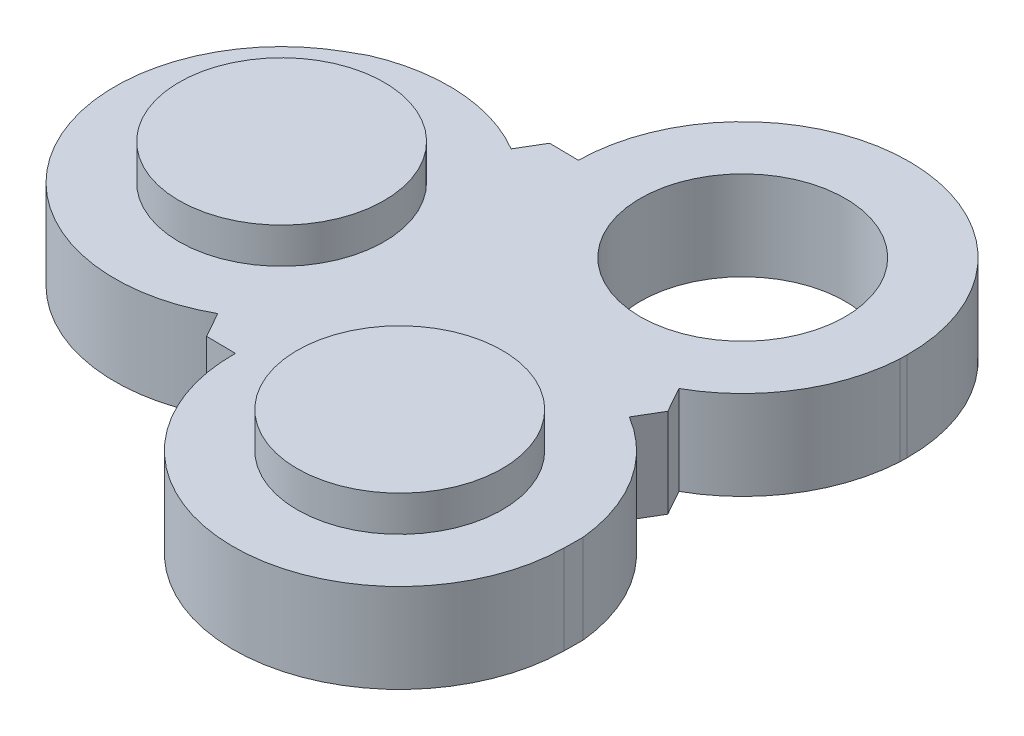
ISO-10303-21;
HEADER;
FILE_DESCRIPTION(('STEP AP214'),'2;1');
FILE_NAME('part.step','',(''),(''),'','','');
FILE_SCHEMA(('AUTOMOTIVE_DESIGN { 1 0 10303 214 1 1 1 1 }'));
ENDSEC;
DATA;
#1=APPLICATION_CONTEXT('core data for automotive mechanical design processes');
#2=APPLICATION_PROTOCOL_DEFINITION('international standard','automotive_design',2000,#1);
#3=PRODUCT_CONTEXT('',#1,'mechanical');
#4=PRODUCT('Part','Part','',(#3));
#5=PRODUCT_RELATED_PRODUCT_CATEGORY('part','',(#4));
#6=PRODUCT_DEFINITION_FORMATION('','',#4);
#7=PRODUCT_DEFINITION_CONTEXT('part definition',#1,'design');
#8=PRODUCT_DEFINITION('design','',#6,#7);
#9=PRODUCT_DEFINITION_SHAPE('','',#8);
#10=(LENGTH_UNIT() NAMED_UNIT(*) SI_UNIT(.MILLI.,.METRE.));
#11=(NAMED_UNIT(*) PLANE_ANGLE_UNIT() SI_UNIT($,.RADIAN.));
#12=(NAMED_UNIT(*) SI_UNIT($,.STERADIAN.) SOLID_ANGLE_UNIT());
#13=UNCERTAINTY_MEASURE_WITH_UNIT(LENGTH_MEASURE(1.E-05),#10,'distance_accuracy_value','');
#14=(GEOMETRIC_REPRESENTATION_CONTEXT(3) GLOBAL_UNCERTAINTY_ASSIGNED_CONTEXT((#13)) GLOBAL_UNIT_ASSIGNED_CONTEXT((#10,
#11,#12)) REPRESENTATION_CONTEXT('',''));
#15=CARTESIAN_POINT('',(0.,0.,0.));
#16=DIRECTION('',(0.,0.,1.));
#17=DIRECTION('',(1.,0.,0.));
#18=AXIS2_PLACEMENT_3D('',#15,#16,#17);
#19=CARTESIAN_POINT('',(-11.0081982102361,3.,-0.13868374074223));
#20=DIRECTION('',(0.,1.,0.));
#21=DIRECTION('',(0.,0.,1.));
#22=AXIS2_PLACEMENT_3D('',#19,#20,#21);
#23=CYLINDRICAL_SURFACE('',#22,5.75);
#24=CARTESIAN_POINT('',(-11.0081982102361,3.,-0.13868374074223));
#25=DIRECTION('',(0.,1.,0.));
#26=DIRECTION('',(0.,0.,1.));
#27=AXIS2_PLACEMENT_3D('',#24,#25,#26);
#28=CIRCLE('',#27,5.75);
#29=CARTESIAN_POINT('',(-11.0081982102361,3.,5.61131625925777));
#30=VERTEX_POINT('',#29);
#31=EDGE_CURVE('E12',#30,#30,#28,.T.);
#32=ORIENTED_EDGE('',*,*,#31,.T.);
#33=EDGE_LOOP('',(#32));
#34=FACE_BOUND('',#33,.T.);
#35=CARTESIAN_POINT('',(-11.0081982102361,7.,-0.13868374074223));
#36=DIRECTION('',(0.,1.,0.));
#37=DIRECTION('',(0.,0.,1.));
#38=AXIS2_PLACEMENT_3D('',#35,#36,#37);
#39=CIRCLE('',#38,5.75);
#40=CARTESIAN_POINT('',(-11.0081982102361,7.,5.61131625925777));
#41=VERTEX_POINT('',#40);
#42=EDGE_CURVE('E195',#41,#41,#39,.T.);
#43=ORIENTED_EDGE('',*,*,#42,.F.);
#44=EDGE_LOOP('',(#43));
#45=FACE_BOUND('',#44,.T.);
#46=ADVANCED_FACE('F189',(#34,#45),#23,.T.);
#47=CARTESIAN_POINT('',(-11.0081982102361,3.,-0.13868374074223));
#48=DIRECTION('',(0.,1.,0.));
#49=DIRECTION('',(0.,0.,1.));
#50=AXIS2_PLACEMENT_3D('',#47,#48,#49);
#51=PLANE('',#50);
#52=ORIENTED_EDGE('',*,*,#31,.F.);
#53=EDGE_LOOP('',(#52));
#54=FACE_BOUND('',#53,.T.);
#55=ADVANCED_FACE('F204',(#54),#51,.F.);
#56=CARTESIAN_POINT('',(-11.0081982102361,7.,-0.13868374074223));
#57=DIRECTION('',(0.,1.,0.));
#58=DIRECTION('',(0.,0.,1.));
#59=AXIS2_PLACEMENT_3D('',#56,#57,#58);
#60=PLANE('',#59);
#61=ORIENTED_EDGE('',*,*,#42,.T.);
#62=EDGE_LOOP('',(#61));
#63=FACE_BOUND('',#62,.T.);
#64=ADVANCED_FACE('F201',(#63),#60,.T.);
#65=CLOSED_SHELL('',(#46,#55,#64));
#66=MANIFOLD_SOLID_BREP('B2',#65);
#67=CARTESIAN_POINT('',(5.32530520249275,3.,9.56784325228541));
#68=DIRECTION('',(0.,1.,0.));
#69=DIRECTION('',(0.,0.,1.));
#70=AXIS2_PLACEMENT_3D('',#67,#68,#69);
#71=CYLINDRICAL_SURFACE('',#70,5.75000000000001);
#72=CARTESIAN_POINT('',(5.32530520249275,3.,9.56784325228541));
#73=DIRECTION('',(0.,1.,0.));
#74=DIRECTION('',(0.,0.,1.));
#75=AXIS2_PLACEMENT_3D('',#72,#73,#74);
#76=CIRCLE('',#75,5.75000000000001);
#77=CARTESIAN_POINT('',(5.32530520249275,3.,15.3178432522854));
#78=VERTEX_POINT('',#77);
#79=EDGE_CURVE('E188',#78,#78,#76,.T.);
#80=ORIENTED_EDGE('',*,*,#79,.T.);
#81=EDGE_LOOP('',(#80));
#82=FACE_BOUND('',#81,.T.);
#83=CARTESIAN_POINT('',(5.32530520249275,7.,9.56784325228541));
#84=DIRECTION('',(0.,1.,0.));
#85=DIRECTION('',(0.,0.,1.));
#86=AXIS2_PLACEMENT_3D('',#83,#84,#85);
#87=CIRCLE('',#86,5.75000000000001);
#88=CARTESIAN_POINT('',(5.32530520249275,7.,15.3178432522854));
#89=VERTEX_POINT('',#88);
#90=EDGE_CURVE('E244',#89,#89,#87,.T.);
#91=ORIENTED_EDGE('',*,*,#90,.F.);
#92=EDGE_LOOP('',(#91));
#93=FACE_BOUND('',#92,.T.);
#94=ADVANCED_FACE('F238',(#82,#93),#71,.T.);
#95=CARTESIAN_POINT('',(5.32530520249275,3.,9.56784325228541));
#96=DIRECTION('',(0.,1.,0.));
#97=DIRECTION('',(0.,0.,1.));
#98=AXIS2_PLACEMENT_3D('',#95,#96,#97);
#99=PLANE('',#98);
#100=ORIENTED_EDGE('',*,*,#79,.F.);
#101=EDGE_LOOP('',(#100));
#102=FACE_BOUND('',#101,.T.);
#103=ADVANCED_FACE('F253',(#102),#99,.F.);
#104=CARTESIAN_POINT('',(5.32530520249275,7.,9.56784325228541));
#105=DIRECTION('',(0.,1.,0.));
#106=DIRECTION('',(0.,0.,1.));
#107=AXIS2_PLACEMENT_3D('',#104,#105,#106);
#108=PLANE('',#107);
#109=ORIENTED_EDGE('',*,*,#90,.T.);
#110=EDGE_LOOP('',(#109));
#111=FACE_BOUND('',#110,.T.);
#112=ADVANCED_FACE('F250',(#111),#108,.T.);
#113=CLOSED_SHELL('',(#94,#103,#112));
#114=MANIFOLD_SOLID_BREP('B7',#113);
#115=CARTESIAN_POINT('',(0.,5.,0.));
#116=DIRECTION('',(0.,1.,0.));
#117=DIRECTION('',(0.,0.,1.));
#118=AXIS2_PLACEMENT_3D('',#115,#116,#117);
#119=PLANE('',#118);
#120=CARTESIAN_POINT('',(5.56465245460964,5.,-9.43064913245143));
#121=DIRECTION('',(0.,1.,0.));
#122=DIRECTION('',(0.,0.,1.));
#123=AXIS2_PLACEMENT_3D('',#120,#121,#122);
#124=CIRCLE('',#123,5.75000000000001);
#125=CARTESIAN_POINT('',(5.56465245460964,5.,-3.68064913245143));
#126=VERTEX_POINT('',#125);
#127=EDGE_CURVE('E468',#126,#126,#124,.T.);
#128=ORIENTED_EDGE('',*,*,#127,.F.);
#129=EDGE_LOOP('',(#128));
#130=FACE_BOUND('',#129,.T.);
#131=CARTESIAN_POINT('',(5.32530520249275,5.,9.56784325228541));
#132=DIRECTION('',(0.,1.,0.));
#133=DIRECTION('',(0.,0.,1.));
#134=AXIS2_PLACEMENT_3D('',#131,#132,#133);
#135=CIRCLE('',#134,5.75);
#136=CARTESIAN_POINT('',(5.32530520249275,5.,15.3178432522854));
#137=VERTEX_POINT('',#136);
#138=EDGE_CURVE('E463',#137,#137,#135,.T.);
#139=ORIENTED_EDGE('',*,*,#138,.F.);
#140=EDGE_LOOP('',(#139));
#141=FACE_BOUND('',#140,.T.);
#142=CARTESIAN_POINT('',(-11.0081982102361,5.,-0.13868374074223));
#143=DIRECTION('',(0.,1.,0.));
#144=DIRECTION('',(0.,0.,1.));
#145=AXIS2_PLACEMENT_3D('',#142,#143,#144);
#146=CIRCLE('',#145,5.75);
#147=CARTESIAN_POINT('',(-11.0081982102361,5.,5.61131625925777));
#148=VERTEX_POINT('',#147);
#149=EDGE_CURVE('E467',#148,#148,#146,.T.);
#150=ORIENTED_EDGE('',*,*,#149,.F.);
#151=EDGE_LOOP('',(#150));
#152=FACE_BOUND('',#151,.T.);
#153=DIRECTION('',(-0.510869841738297,0.,0.859658074354151));
#154=VECTOR('',#153,1.);
#155=CARTESIAN_POINT('',(-1.1006195570536,5.,-16.8105036264622));
#156=LINE('',#155,#154);
#157=CARTESIAN_POINT('',(-5.40413223791524,5.,-9.56883633289091));
#158=VERTEX_POINT('',#157);
#159=CARTESIAN_POINT('',(-6.20931797443657,5.,-8.21392288292074));
#160=VERTEX_POINT('',#159);
#161=EDGE_CURVE('E547',#158,#160,#156,.T.);
#162=ORIENTED_EDGE('',*,*,#161,.T.);
#163=CARTESIAN_POINT('',(-11.0081982102361,5.,-0.13868374074223));
#164=DIRECTION('',(0.,1.,0.));
#165=DIRECTION('',(0.,0.,1.));
#166=AXIS2_PLACEMENT_3D('',#163,#164,#165);
#167=CIRCLE('',#166,9.3935477174984);
#168=CARTESIAN_POINT('',(-14.7353188442584,5.,-8.76117238963965));
#169=VERTEX_POINT('',#168);
#170=EDGE_CURVE('E438',#160,#169,#167,.T.);
#171=ORIENTED_EDGE('',*,*,#170,.T.);
#172=DIRECTION('',(-0.872255298149777,0.,0.489050810089958));
#173=VECTOR('',#172,1.);
#174=CARTESIAN_POINT('',(-15.5777729634688,5.,-8.28883032380479));
#175=LINE('',#174,#173);
#176=CARTESIAN_POINT('',(-15.5777729634688,5.,-8.28883032380479));
#177=VERTEX_POINT('',#176);
#178=EDGE_CURVE('E434',#169,#177,#175,.T.);
#179=ORIENTED_EDGE('',*,*,#178,.T.);
#180=CARTESIAN_POINT('',(-11.0081982102361,5.,-0.13868374074223));
#181=DIRECTION('',(0.,1.,0.));
#182=DIRECTION('',(0.,0.,1.));
#183=AXIS2_PLACEMENT_3D('',#180,#181,#182);
#184=CIRCLE('',#183,9.34376277260867);
#185=CARTESIAN_POINT('',(-6.43862345700346,5.,8.01146284232033));
#186=VERTEX_POINT('',#185);
#187=EDGE_CURVE('E437',#177,#186,#184,.T.);
#188=ORIENTED_EDGE('',*,*,#187,.T.);
#189=DIRECTION('',(0.489050810089958,0.,0.872255298149777));
#190=VECTOR('',#189,1.);
#191=CARTESIAN_POINT('',(-6.43862345700346,5.,8.01146284232033));
#192=LINE('',#191,#190);
#193=CARTESIAN_POINT('',(-5.64347949003213,5.,9.42965605184594));
#194=VERTEX_POINT('',#193);
#195=EDGE_CURVE('E282',#186,#194,#192,.T.);
#196=ORIENTED_EDGE('',*,*,#195,.T.);
#197=DIRECTION('',(0.999920651828255,0.,0.0125972237956252));
#198=VECTOR('',#197,1.);
#199=CARTESIAN_POINT('',(-14.0084680002886,5.,9.32427205750712));
#200=LINE('',#199,#198);
#201=CARTESIAN_POINT('',(-4.00926148200608,5.,9.45024429546337));
#202=VERTEX_POINT('',#201);
#203=EDGE_CURVE('E413',#194,#202,#200,.T.);
#204=ORIENTED_EDGE('',*,*,#203,.T.);
#205=CARTESIAN_POINT('',(5.32530520249275,5.,9.56784325228541));
#206=DIRECTION('',(0.,1.,0.));
#207=DIRECTION('',(0.,0.,1.));
#208=AXIS2_PLACEMENT_3D('',#205,#206,#207);
#209=CIRCLE('',#208,9.33530742407561);
#210=CARTESIAN_POINT('',(14.6598718869916,5.,9.68544220910746));
#211=VERTEX_POINT('',#210);
#212=EDGE_CURVE('E408',#202,#211,#209,.T.);
#213=ORIENTED_EDGE('',*,*,#212,.T.);
#214=DIRECTION('',(0.0125972237956255,0.,-0.999920651828255));
#215=VECTOR('',#214,1.);
#216=CARTESIAN_POINT('',(14.8992191391085,5.,-9.31305017562939));
#217=LINE('',#216,#215);
#218=CARTESIAN_POINT('',(14.6730284435592,5.,8.64112380749925));
#219=VERTEX_POINT('',#218);
#220=EDGE_CURVE('E386',#211,#219,#217,.T.);
#221=ORIENTED_EDGE('',*,*,#220,.T.);
#222=CARTESIAN_POINT('',(5.32530520249275,5.,9.56784325228541));
#223=DIRECTION('',(0.,1.,0.));
#224=DIRECTION('',(0.,0.,1.));
#225=AXIS2_PLACEMENT_3D('',#222,#223,#224);
#226=CIRCLE('',#225,9.3935477174984);
#227=CARTESIAN_POINT('',(10.1241854382923,5.,1.4926041101069));
#228=VERTEX_POINT('',#227);
#229=EDGE_CURVE('E396',#219,#228,#226,.T.);
#230=ORIENTED_EDGE('',*,*,#229,.T.);
#231=DIRECTION('',(0.510869841738297,0.,-0.859658074354152));
#232=VECTOR('',#231,1.);
#233=CARTESIAN_POINT('',(10.1241854382923,5.,1.4926041101069));
#234=LINE('',#233,#232);
#235=CARTESIAN_POINT('',(10.9293711748136,5.,0.137690660136722));
#236=VERTEX_POINT('',#235);
#237=EDGE_CURVE('E404',#228,#236,#234,.T.);
#238=ORIENTED_EDGE('',*,*,#237,.T.);
#239=DIRECTION('',(-0.489050810089957,0.,-0.872255298149777));
#240=VECTOR('',#239,1.);
#241=CARTESIAN_POINT('',(15.0247353087419,5.,7.4420504321089));
#242=LINE('',#241,#240);
#243=CARTESIAN_POINT('',(10.1342272078423,5.,-1.28050254938887));
#244=VERTEX_POINT('',#243);
#245=EDGE_CURVE('E426',#236,#244,#242,.T.);
#246=ORIENTED_EDGE('',*,*,#245,.T.);
#247=CARTESIAN_POINT('',(5.56465245460964,5.,-9.43064913245143));
#248=DIRECTION('',(0.,1.,0.));
#249=DIRECTION('',(0.,0.,1.));
#250=AXIS2_PLACEMENT_3D('',#247,#248,#249);
#251=CIRCLE('',#250,9.34376277260867);
#252=CARTESIAN_POINT('',(14.8942128234531,5.,-8.91566750666909));
#253=VERTEX_POINT('',#252);
#254=EDGE_CURVE('E419',#244,#253,#251,.T.);
#255=ORIENTED_EDGE('',*,*,#254,.T.);
#256=CARTESIAN_POINT('',(14.8992191391085,5.,-9.31305017562939));
#257=VERTEX_POINT('',#256);
#258=EDGE_CURVE('E411',#253,#257,#217,.T.);
#259=ORIENTED_EDGE('',*,*,#258,.T.);
#260=CARTESIAN_POINT('',(5.56465245460964,5.,-9.43064913245143));
#261=DIRECTION('',(0.,1.,0.));
#262=DIRECTION('',(0.,0.,1.));
#263=AXIS2_PLACEMENT_3D('',#260,#261,#262);
#264=CIRCLE('',#263,9.33530742407561);
#265=CARTESIAN_POINT('',(-3.7699142298892,5.,-9.54824808927347));
#266=VERTEX_POINT('',#265);
#267=EDGE_CURVE('E418',#257,#266,#264,.T.);
#268=ORIENTED_EDGE('',*,*,#267,.T.);
#269=DIRECTION('',(-0.999920651828255,0.,-0.0125972237956252));
#270=VECTOR('',#269,1.);
#271=CARTESIAN_POINT('',(-3.7699142298892,5.,-9.54824808927347));
#272=LINE('',#271,#270);
#273=EDGE_CURVE('E425',#266,#158,#272,.T.);
#274=ORIENTED_EDGE('',*,*,#273,.T.);
#275=EDGE_LOOP('',(#162,#171,#179,#188,#196,#204,#213,#221,#230,#238,#246,#255,#259,#268,#274));
#276=FACE_BOUND('',#275,.T.);
#277=ADVANCED_FACE('F278',(#130,#141,#152,#276),#119,.T.);
#278=CARTESIAN_POINT('',(0.,0.,0.));
#279=DIRECTION('',(0.,1.,0.));
#280=DIRECTION('',(0.,0.,1.));
#281=AXIS2_PLACEMENT_3D('',#278,#279,#280);
#282=PLANE('',#281);
#283=CARTESIAN_POINT('',(5.56465245460964,0.,-9.43064913245143));
#284=DIRECTION('',(0.,1.,0.));
#285=DIRECTION('',(0.,0.,1.));
#286=AXIS2_PLACEMENT_3D('',#283,#284,#285);
#287=CIRCLE('',#286,5.75000000000001);
#288=CARTESIAN_POINT('',(5.56465245460964,0.,-3.68064913245143));
#289=VERTEX_POINT('',#288);
#290=EDGE_CURVE('E477',#289,#289,#287,.T.);
#291=ORIENTED_EDGE('',*,*,#290,.T.);
#292=EDGE_LOOP('',(#291));
#293=FACE_BOUND('',#292,.T.);
#294=CARTESIAN_POINT('',(5.32530520249275,0.,9.56784325228541));
#295=DIRECTION('',(0.,1.,0.));
#296=DIRECTION('',(0.,0.,1.));
#297=AXIS2_PLACEMENT_3D('',#294,#295,#296);
#298=CIRCLE('',#297,5.75);
#299=CARTESIAN_POINT('',(5.32530520249275,0.,15.3178432522854));
#300=VERTEX_POINT('',#299);
#301=EDGE_CURVE('E481',#300,#300,#298,.T.);
#302=ORIENTED_EDGE('',*,*,#301,.T.);
#303=EDGE_LOOP('',(#302));
#304=FACE_BOUND('',#303,.T.);
#305=CARTESIAN_POINT('',(-11.0081982102361,0.,-0.13868374074223));
#306=DIRECTION('',(0.,1.,0.));
#307=DIRECTION('',(0.,0.,1.));
#308=AXIS2_PLACEMENT_3D('',#305,#306,#307);
#309=CIRCLE('',#308,5.75);
#310=CARTESIAN_POINT('',(-11.0081982102361,0.,5.61131625925777));
#311=VERTEX_POINT('',#310);
#312=EDGE_CURVE('E476',#311,#311,#309,.T.);
#313=ORIENTED_EDGE('',*,*,#312,.T.);
#314=EDGE_LOOP('',(#313));
#315=FACE_BOUND('',#314,.T.);
#316=CARTESIAN_POINT('',(-11.0081982102361,0.,-0.13868374074223));
#317=DIRECTION('',(0.,1.,0.));
#318=DIRECTION('',(0.,0.,1.));
#319=AXIS2_PLACEMENT_3D('',#316,#317,#318);
#320=CIRCLE('',#319,9.3935477174984);
#321=CARTESIAN_POINT('',(-6.20931797443657,0.,-8.21392288292074));
#322=VERTEX_POINT('',#321);
#323=CARTESIAN_POINT('',(-14.7353188442583,0.,-8.76117238963968));
#324=VERTEX_POINT('',#323);
#325=EDGE_CURVE('E532',#322,#324,#320,.T.);
#326=ORIENTED_EDGE('',*,*,#325,.F.);
#327=DIRECTION('',(-0.510869841738297,0.,0.859658074354151));
#328=VECTOR('',#327,1.);
#329=CARTESIAN_POINT('',(-8.19609683638978,0.,-4.87070245553611));
#330=LINE('',#329,#328);
#331=CARTESIAN_POINT('',(-5.40413223791524,0.,-9.56883633289091));
#332=VERTEX_POINT('',#331);
#333=EDGE_CURVE('E523',#332,#322,#330,.T.);
#334=ORIENTED_EDGE('',*,*,#333,.F.);
#335=DIRECTION('',(-0.999920651828255,0.,-0.0125972237956252));
#336=VECTOR('',#335,1.);
#337=CARTESIAN_POINT('',(0.11967362605844,0.,-9.49924619236842));
#338=LINE('',#337,#336);
#339=CARTESIAN_POINT('',(-3.7699142298892,0.,-9.54824808927347));
#340=VERTEX_POINT('',#339);
#341=EDGE_CURVE('E461',#340,#332,#338,.T.);
#342=ORIENTED_EDGE('',*,*,#341,.F.);
#343=CARTESIAN_POINT('',(5.56465245460964,0.,-9.43064913245143));
#344=DIRECTION('',(0.,1.,0.));
#345=DIRECTION('',(0.,0.,1.));
#346=AXIS2_PLACEMENT_3D('',#343,#344,#345);
#347=CIRCLE('',#346,9.33530742407561);
#348=CARTESIAN_POINT('',(14.8992191391085,0.,-9.31305017562939));
#349=VERTEX_POINT('',#348);
#350=EDGE_CURVE('E462',#349,#340,#347,.T.);
#351=ORIENTED_EDGE('',*,*,#350,.F.);
#352=DIRECTION('',(0.0125972237956255,0.,-0.999920651828255));
#353=VECTOR('',#352,1.);
#354=CARTESIAN_POINT('',(14.77954551305,0.,0.186196016739038));
#355=LINE('',#354,#353);
#356=CARTESIAN_POINT('',(14.8942128234531,0.,-8.91566750666905));
#357=VERTEX_POINT('',#356);
#358=EDGE_CURVE('E457',#357,#349,#355,.T.);
#359=ORIENTED_EDGE('',*,*,#358,.F.);
#360=CARTESIAN_POINT('',(5.56465245460964,0.,-9.43064913245143));
#361=DIRECTION('',(0.,1.,0.));
#362=DIRECTION('',(0.,0.,1.));
#363=AXIS2_PLACEMENT_3D('',#360,#361,#362);
#364=CIRCLE('',#363,9.34376277260867);
#365=CARTESIAN_POINT('',(10.1342272078423,0.,-1.28050254938887));
#366=VERTEX_POINT('',#365);
#367=EDGE_CURVE('E498',#366,#357,#364,.T.);
#368=ORIENTED_EDGE('',*,*,#367,.F.);
#369=DIRECTION('',(-0.489050810089957,0.,-0.872255298149777));
#370=VECTOR('',#369,1.);
#371=CARTESIAN_POINT('',(8.25665018588136,0.,-4.62928854728643));
#372=LINE('',#371,#370);
#373=CARTESIAN_POINT('',(10.9293711748136,0.,0.137690660136721));
#374=VERTEX_POINT('',#373);
#375=EDGE_CURVE('E488',#374,#366,#372,.T.);
#376=ORIENTED_EDGE('',*,*,#375,.F.);
#377=DIRECTION('',(0.510869841738296,0.,-0.859658074354152));
#378=VECTOR('',#377,1.);
#379=CARTESIAN_POINT('',(8.13740657633909,0.,4.83582453749153));
#380=LINE('',#379,#378);
#381=CARTESIAN_POINT('',(10.1241854382923,0.,1.4926041101069));
#382=VERTEX_POINT('',#381);
#383=EDGE_CURVE('E493',#382,#374,#380,.T.);
#384=ORIENTED_EDGE('',*,*,#383,.F.);
#385=CARTESIAN_POINT('',(5.32530520249275,0.,9.56784325228541));
#386=DIRECTION('',(0.,1.,0.));
#387=DIRECTION('',(0.,0.,1.));
#388=AXIS2_PLACEMENT_3D('',#385,#386,#387);
#389=CIRCLE('',#388,9.3935477174984);
#390=CARTESIAN_POINT('',(14.6730284435592,0.,8.64112380749923));
#391=VERTEX_POINT('',#390);
#392=EDGE_CURVE('E501',#391,#382,#389,.T.);
#393=ORIENTED_EDGE('',*,*,#392,.F.);
#394=DIRECTION('',(0.0125972237956255,0.,-0.999920651828255));
#395=VECTOR('',#394,1.);
#396=CARTESIAN_POINT('',(14.77954551305,0.,0.186196016739038));
#397=LINE('',#396,#395);
#398=CARTESIAN_POINT('',(14.6598718869916,0.,9.68544220910746));
#399=VERTEX_POINT('',#398);
#400=EDGE_CURVE('E389',#399,#391,#397,.T.);
#401=ORIENTED_EDGE('',*,*,#400,.F.);
#402=CARTESIAN_POINT('',(5.32530520249275,0.,9.56784325228541));
#403=DIRECTION('',(0.,1.,0.));
#404=DIRECTION('',(0.,0.,1.));
#405=AXIS2_PLACEMENT_3D('',#402,#403,#404);
#406=CIRCLE('',#405,9.33530742407561);
#407=CARTESIAN_POINT('',(-4.00926148200608,0.,9.45024429546337));
#408=VERTEX_POINT('',#407);
#409=EDGE_CURVE('E452',#408,#399,#406,.T.);
#410=ORIENTED_EDGE('',*,*,#409,.F.);
#411=DIRECTION('',(0.999920651828255,0.,0.0125972237956252));
#412=VECTOR('',#411,1.);
#413=CARTESIAN_POINT('',(-0.119673626058439,0.,9.49924619236842));
#414=LINE('',#413,#412);
#415=CARTESIAN_POINT('',(-5.64347949003213,0.,9.42965605184594));
#416=VERTEX_POINT('',#415);
#417=EDGE_CURVE('E393',#416,#408,#414,.T.);
#418=ORIENTED_EDGE('',*,*,#417,.F.);
#419=DIRECTION('',(0.489050810089958,0.,0.872255298149777));
#420=VECTOR('',#419,1.);
#421=CARTESIAN_POINT('',(-8.31620047896441,0.,4.66267684442276));
#422=LINE('',#421,#420);
#423=CARTESIAN_POINT('',(-6.43862345700346,0.,8.01146284232033));
#424=VERTEX_POINT('',#423);
#425=EDGE_CURVE('E472',#424,#416,#422,.T.);
#426=ORIENTED_EDGE('',*,*,#425,.F.);
#427=CARTESIAN_POINT('',(-11.0081982102361,0.,-0.13868374074223));
#428=DIRECTION('',(0.,1.,0.));
#429=DIRECTION('',(0.,0.,1.));
#430=AXIS2_PLACEMENT_3D('',#427,#428,#429);
#431=CIRCLE('',#430,9.34376277260867);
#432=CARTESIAN_POINT('',(-15.5777729634688,0.,-8.28883032380479));
#433=VERTEX_POINT('',#432);
#434=EDGE_CURVE('E522',#433,#424,#431,.T.);
#435=ORIENTED_EDGE('',*,*,#434,.F.);
#436=DIRECTION('',(-0.872255298149777,0.,0.489050810089958));
#437=VECTOR('',#436,1.);
#438=CARTESIAN_POINT('',(-7.26157248450438,0.,-12.9515071682276));
#439=LINE('',#438,#437);
#440=EDGE_CURVE('E349',#324,#433,#439,.T.);
#441=ORIENTED_EDGE('',*,*,#440,.F.);
#442=EDGE_LOOP('',(#326,#334,#342,#351,#359,#368,#376,#384,#393,#401,#410,#418,#426,#435,#441));
#443=FACE_BOUND('',#442,.T.);
#444=ADVANCED_FACE('F280',(#293,#304,#315,#443),#282,.F.);
#445=CARTESIAN_POINT('',(5.56465245460964,-45.,-9.43064913245143));
#446=DIRECTION('',(0.,1.,0.));
#447=DIRECTION('',(0.,0.,1.));
#448=AXIS2_PLACEMENT_3D('',#445,#446,#447);
#449=CYLINDRICAL_SURFACE('',#448,5.75000000000001);
#450=ORIENTED_EDGE('',*,*,#127,.T.);
#451=EDGE_LOOP('',(#450));
#452=FACE_BOUND('',#451,.T.);
#453=ORIENTED_EDGE('',*,*,#290,.F.);
#454=EDGE_LOOP('',(#453));
#455=FACE_BOUND('',#454,.T.);
#456=ADVANCED_FACE('F619',(#452,#455),#449,.F.);
#457=CARTESIAN_POINT('',(5.32530520249275,-45.,9.56784325228541));
#458=DIRECTION('',(0.,1.,0.));
#459=DIRECTION('',(0.,0.,1.));
#460=AXIS2_PLACEMENT_3D('',#457,#458,#459);
#461=CYLINDRICAL_SURFACE('',#460,5.75);
#462=ORIENTED_EDGE('',*,*,#138,.T.);
#463=EDGE_LOOP('',(#462));
#464=FACE_BOUND('',#463,.T.);
#465=ORIENTED_EDGE('',*,*,#301,.F.);
#466=EDGE_LOOP('',(#465));
#467=FACE_BOUND('',#466,.T.);
#468=ADVANCED_FACE('F633',(#464,#467),#461,.F.);
#469=CARTESIAN_POINT('',(-11.0081982102361,-45.,-0.13868374074223));
#470=DIRECTION('',(0.,1.,0.));
#471=DIRECTION('',(0.,0.,1.));
#472=AXIS2_PLACEMENT_3D('',#469,#470,#471);
#473=CYLINDRICAL_SURFACE('',#472,5.75);
#474=ORIENTED_EDGE('',*,*,#149,.T.);
#475=EDGE_LOOP('',(#474));
#476=FACE_BOUND('',#475,.T.);
#477=ORIENTED_EDGE('',*,*,#312,.F.);
#478=EDGE_LOOP('',(#477));
#479=FACE_BOUND('',#478,.T.);
#480=ADVANCED_FACE('F654',(#476,#479),#473,.F.);
#481=CARTESIAN_POINT('',(-6.43862345700346,-45.,8.01146284232033));
#482=DIRECTION('',(-0.872255298149777,0.,0.489050810089957));
#483=DIRECTION('',(0.489050810089958,0.,0.872255298149777));
#484=AXIS2_PLACEMENT_3D('',#481,#482,#483);
#485=PLANE('',#484);
#486=ORIENTED_EDGE('',*,*,#425,.T.);
#487=DIRECTION('',(0.,-1.,0.));
#488=VECTOR('',#487,1.);
#489=CARTESIAN_POINT('',(-5.64347949003213,-45.,9.42965605184594));
#490=LINE('',#489,#488);
#491=EDGE_CURVE('E236',#194,#416,#490,.T.);
#492=ORIENTED_EDGE('',*,*,#491,.F.);
#493=ORIENTED_EDGE('',*,*,#195,.F.);
#494=DIRECTION('',(0.,1.,0.));
#495=VECTOR('',#494,1.);
#496=CARTESIAN_POINT('',(-6.43862345700346,-45.,8.01146284232033));
#497=LINE('',#496,#495);
#498=EDGE_CURVE('E529',#424,#186,#497,.T.);
#499=ORIENTED_EDGE('',*,*,#498,.F.);
#500=EDGE_LOOP('',(#486,#492,#493,#499));
#501=FACE_BOUND('',#500,.T.);
#502=ADVANCED_FACE('F650',(#501),#485,.T.);
#503=CARTESIAN_POINT('',(-11.0081982102361,-45.,-0.13868374074223));
#504=DIRECTION('',(0.,1.,0.));
#505=DIRECTION('',(0.,0.,1.));
#506=AXIS2_PLACEMENT_3D('',#503,#504,#505);
#507=CYLINDRICAL_SURFACE('',#506,9.34376277260867);
#508=ORIENTED_EDGE('',*,*,#434,.T.);
#509=ORIENTED_EDGE('',*,*,#498,.T.);
#510=ORIENTED_EDGE('',*,*,#187,.F.);
#511=DIRECTION('',(0.,1.,0.));
#512=VECTOR('',#511,1.);
#513=CARTESIAN_POINT('',(-15.5777729634688,-45.,-8.28883032380479));
#514=LINE('',#513,#512);
#515=EDGE_CURVE('E342',#433,#177,#514,.T.);
#516=ORIENTED_EDGE('',*,*,#515,.F.);
#517=EDGE_LOOP('',(#508,#509,#510,#516));
#518=FACE_BOUND('',#517,.T.);
#519=ADVANCED_FACE('F653',(#518),#507,.T.);
#520=CARTESIAN_POINT('',(-15.5777729634688,-45.,-8.28883032380479));
#521=DIRECTION('',(-0.489050810089958,0.,-0.872255298149777));
#522=DIRECTION('',(-0.872255298149777,0.,0.489050810089958));
#523=AXIS2_PLACEMENT_3D('',#520,#521,#522);
#524=PLANE('',#523);
#525=ORIENTED_EDGE('',*,*,#440,.T.);
#526=ORIENTED_EDGE('',*,*,#515,.T.);
#527=ORIENTED_EDGE('',*,*,#178,.F.);
#528=DIRECTION('',(0.,1.,0.));
#529=VECTOR('',#528,1.);
#530=CARTESIAN_POINT('',(-14.7353188442583,-45.,-8.76117238963968));
#531=LINE('',#530,#529);
#532=EDGE_CURVE('E512',#324,#169,#531,.T.);
#533=ORIENTED_EDGE('',*,*,#532,.F.);
#534=EDGE_LOOP('',(#525,#526,#527,#533));
#535=FACE_BOUND('',#534,.T.);
#536=ADVANCED_FACE('F649',(#535),#524,.T.);
#537=CARTESIAN_POINT('',(-1.1006195570536,-45.,-16.8105036264622));
#538=DIRECTION('',(-0.859658074354151,0.,-0.510869841738297));
#539=DIRECTION('',(-0.510869841738297,0.,0.859658074354151));
#540=AXIS2_PLACEMENT_3D('',#537,#538,#539);
#541=PLANE('',#540);
#542=ORIENTED_EDGE('',*,*,#333,.T.);
#543=DIRECTION('',(0.,1.,0.));
#544=VECTOR('',#543,1.);
#545=CARTESIAN_POINT('',(-6.20931797443657,-45.,-8.21392288292074));
#546=LINE('',#545,#544);
#547=EDGE_CURVE('E526',#322,#160,#546,.T.);
#548=ORIENTED_EDGE('',*,*,#547,.T.);
#549=ORIENTED_EDGE('',*,*,#161,.F.);
#550=DIRECTION('',(0.,1.,0.));
#551=VECTOR('',#550,1.);
#552=CARTESIAN_POINT('',(-5.40413223791524,-45.,-9.56883633289091));
#553=LINE('',#552,#551);
#554=EDGE_CURVE('E492',#332,#158,#553,.T.);
#555=ORIENTED_EDGE('',*,*,#554,.F.);
#556=EDGE_LOOP('',(#542,#548,#549,#555));
#557=FACE_BOUND('',#556,.T.);
#558=ADVANCED_FACE('F593',(#557),#541,.T.);
#559=CARTESIAN_POINT('',(-11.0081982102361,-45.,-0.13868374074223));
#560=DIRECTION('',(0.,1.,0.));
#561=DIRECTION('',(0.,0.,1.));
#562=AXIS2_PLACEMENT_3D('',#559,#560,#561);
#563=CYLINDRICAL_SURFACE('',#562,9.3935477174984);
#564=ORIENTED_EDGE('',*,*,#325,.T.);
#565=ORIENTED_EDGE('',*,*,#532,.T.);
#566=ORIENTED_EDGE('',*,*,#170,.F.);
#567=ORIENTED_EDGE('',*,*,#547,.F.);
#568=EDGE_LOOP('',(#564,#565,#566,#567));
#569=FACE_BOUND('',#568,.T.);
#570=ADVANCED_FACE('F594',(#569),#563,.T.);
#571=CARTESIAN_POINT('',(5.56465245460964,-45.,-9.43064913245143));
#572=DIRECTION('',(0.,1.,0.));
#573=DIRECTION('',(0.,0.,1.));
#574=AXIS2_PLACEMENT_3D('',#571,#572,#573);
#575=CYLINDRICAL_SURFACE('',#574,9.33530742407561);
#576=ORIENTED_EDGE('',*,*,#350,.T.);
#577=DIRECTION('',(0.,1.,0.));
#578=VECTOR('',#577,1.);
#579=CARTESIAN_POINT('',(-3.7699142298892,-45.,-9.54824808927347));
#580=LINE('',#579,#578);
#581=EDGE_CURVE('E458',#340,#266,#580,.T.);
#582=ORIENTED_EDGE('',*,*,#581,.T.);
#583=ORIENTED_EDGE('',*,*,#267,.F.);
#584=DIRECTION('',(0.,1.,0.));
#585=VECTOR('',#584,1.);
#586=CARTESIAN_POINT('',(14.8992191391085,-45.,-9.31305017562939));
#587=LINE('',#586,#585);
#588=EDGE_CURVE('E453',#349,#257,#587,.T.);
#589=ORIENTED_EDGE('',*,*,#588,.F.);
#590=EDGE_LOOP('',(#576,#582,#583,#589));
#591=FACE_BOUND('',#590,.T.);
#592=ADVANCED_FACE('F581',(#591),#575,.T.);
#593=CARTESIAN_POINT('',(-3.7699142298892,-45.,-9.54824808927347));
#594=DIRECTION('',(0.0125972237956252,0.,-0.999920651828255));
#595=DIRECTION('',(-0.999920651828255,0.,-0.0125972237956252));
#596=AXIS2_PLACEMENT_3D('',#593,#594,#595);
#597=PLANE('',#596);
#598=ORIENTED_EDGE('',*,*,#341,.T.);
#599=ORIENTED_EDGE('',*,*,#554,.T.);
#600=ORIENTED_EDGE('',*,*,#273,.F.);
#601=ORIENTED_EDGE('',*,*,#581,.F.);
#602=EDGE_LOOP('',(#598,#599,#600,#601));
#603=FACE_BOUND('',#602,.T.);
#604=ADVANCED_FACE('F588',(#603),#597,.T.);
#605=CARTESIAN_POINT('',(15.0247353087419,-45.,7.4420504321089));
#606=DIRECTION('',(0.872255298149777,0.,-0.489050810089957));
#607=DIRECTION('',(-0.489050810089957,0.,-0.872255298149777));
#608=AXIS2_PLACEMENT_3D('',#605,#606,#607);
#609=PLANE('',#608);
#610=ORIENTED_EDGE('',*,*,#375,.T.);
#611=DIRECTION('',(0.,1.,0.));
#612=VECTOR('',#611,1.);
#613=CARTESIAN_POINT('',(10.1342272078423,-45.,-1.28050254938887));
#614=LINE('',#613,#612);
#615=EDGE_CURVE('E491',#366,#244,#614,.T.);
#616=ORIENTED_EDGE('',*,*,#615,.T.);
#617=ORIENTED_EDGE('',*,*,#245,.F.);
#618=DIRECTION('',(0.,1.,0.));
#619=VECTOR('',#618,1.);
#620=CARTESIAN_POINT('',(10.9293711748136,-45.,0.137690660136723));
#621=LINE('',#620,#619);
#622=EDGE_CURVE('E497',#374,#236,#621,.T.);
#623=ORIENTED_EDGE('',*,*,#622,.F.);
#624=EDGE_LOOP('',(#610,#616,#617,#623));
#625=FACE_BOUND('',#624,.T.);
#626=ADVANCED_FACE('F565',(#625),#609,.T.);
#627=CARTESIAN_POINT('',(10.1241854382923,-45.,1.4926041101069));
#628=DIRECTION('',(0.859658074354152,0.,0.510869841738296));
#629=DIRECTION('',(0.510869841738296,0.,-0.859658074354152));
#630=AXIS2_PLACEMENT_3D('',#627,#628,#629);
#631=PLANE('',#630);
#632=ORIENTED_EDGE('',*,*,#383,.T.);
#633=ORIENTED_EDGE('',*,*,#622,.T.);
#634=ORIENTED_EDGE('',*,*,#237,.F.);
#635=DIRECTION('',(0.,1.,0.));
#636=VECTOR('',#635,1.);
#637=CARTESIAN_POINT('',(10.1241854382923,-45.,1.4926041101069));
#638=LINE('',#637,#636);
#639=EDGE_CURVE('E399',#382,#228,#638,.T.);
#640=ORIENTED_EDGE('',*,*,#639,.F.);
#641=EDGE_LOOP('',(#632,#633,#634,#640));
#642=FACE_BOUND('',#641,.T.);
#643=ADVANCED_FACE('F572',(#642),#631,.T.);
#644=CARTESIAN_POINT('',(5.56465245460964,-45.,-9.43064913245143));
#645=DIRECTION('',(0.,1.,0.));
#646=DIRECTION('',(0.,0.,1.));
#647=AXIS2_PLACEMENT_3D('',#644,#645,#646);
#648=CYLINDRICAL_SURFACE('',#647,9.34376277260867);
#649=ORIENTED_EDGE('',*,*,#367,.T.);
#650=DIRECTION('',(0.,1.,0.));
#651=VECTOR('',#650,1.);
#652=CARTESIAN_POINT('',(14.8942128234531,-45.,-8.91566750666905));
#653=LINE('',#652,#651);
#654=EDGE_CURVE('E456',#253,#357,#653,.F.);
#655=ORIENTED_EDGE('',*,*,#654,.F.);
#656=ORIENTED_EDGE('',*,*,#254,.F.);
#657=ORIENTED_EDGE('',*,*,#615,.F.);
#658=EDGE_LOOP('',(#649,#655,#656,#657));
#659=FACE_BOUND('',#658,.T.);
#660=ADVANCED_FACE('F603',(#659),#648,.T.);
#661=CARTESIAN_POINT('',(5.32530520249275,-45.,9.56784325228541));
#662=DIRECTION('',(0.,1.,0.));
#663=DIRECTION('',(0.,0.,1.));
#664=AXIS2_PLACEMENT_3D('',#661,#662,#663);
#665=CYLINDRICAL_SURFACE('',#664,9.3935477174984);
#666=ORIENTED_EDGE('',*,*,#392,.T.);
#667=ORIENTED_EDGE('',*,*,#639,.T.);
#668=ORIENTED_EDGE('',*,*,#229,.F.);
#669=DIRECTION('',(0.,1.,0.));
#670=VECTOR('',#669,1.);
#671=CARTESIAN_POINT('',(14.6730284435592,-45.,8.64112380749923));
#672=LINE('',#671,#670);
#673=EDGE_CURVE('E381',#391,#219,#672,.T.);
#674=ORIENTED_EDGE('',*,*,#673,.F.);
#675=EDGE_LOOP('',(#666,#667,#668,#674));
#676=FACE_BOUND('',#675,.T.);
#677=ADVANCED_FACE('F397',(#676),#665,.T.);
#678=CARTESIAN_POINT('',(14.8992191391085,-45.,-9.31305017562939));
#679=DIRECTION('',(0.999920651828255,0.,0.0125972237956255));
#680=DIRECTION('',(0.0125972237956255,0.,-0.999920651828255));
#681=AXIS2_PLACEMENT_3D('',#678,#679,#680);
#682=PLANE('',#681);
#683=ORIENTED_EDGE('',*,*,#358,.T.);
#684=ORIENTED_EDGE('',*,*,#588,.T.);
#685=ORIENTED_EDGE('',*,*,#258,.F.);
#686=ORIENTED_EDGE('',*,*,#654,.T.);
#687=EDGE_LOOP('',(#683,#684,#685,#686));
#688=FACE_BOUND('',#687,.T.);
#689=ADVANCED_FACE('F602',(#688),#682,.T.);
#690=CARTESIAN_POINT('',(5.32530520249275,-45.,9.56784325228541));
#691=DIRECTION('',(0.,1.,0.));
#692=DIRECTION('',(0.,0.,1.));
#693=AXIS2_PLACEMENT_3D('',#690,#691,#692);
#694=CYLINDRICAL_SURFACE('',#693,9.33530742407561);
#695=ORIENTED_EDGE('',*,*,#409,.T.);
#696=DIRECTION('',(0.,1.,0.));
#697=VECTOR('',#696,1.);
#698=CARTESIAN_POINT('',(14.6598718869916,-45.,9.68544220910746));
#699=LINE('',#698,#697);
#700=EDGE_CURVE('E449',#399,#211,#699,.T.);
#701=ORIENTED_EDGE('',*,*,#700,.T.);
#702=ORIENTED_EDGE('',*,*,#212,.F.);
#703=DIRECTION('',(0.,1.,0.));
#704=VECTOR('',#703,1.);
#705=CARTESIAN_POINT('',(-4.00926148200608,-45.,9.45024429546337));
#706=LINE('',#705,#704);
#707=EDGE_CURVE('E289',#408,#202,#706,.T.);
#708=ORIENTED_EDGE('',*,*,#707,.F.);
#709=EDGE_LOOP('',(#695,#701,#702,#708));
#710=FACE_BOUND('',#709,.T.);
#711=ADVANCED_FACE('F639',(#710),#694,.T.);
#712=ORIENTED_EDGE('',*,*,#400,.T.);
#713=ORIENTED_EDGE('',*,*,#673,.T.);
#714=ORIENTED_EDGE('',*,*,#220,.F.);
#715=ORIENTED_EDGE('',*,*,#700,.F.);
#716=EDGE_LOOP('',(#712,#713,#714,#715));
#717=FACE_BOUND('',#716,.T.);
#718=ADVANCED_FACE('F383',(#717),#682,.T.);
#719=CARTESIAN_POINT('',(-14.0084680002886,-45.,9.32427205750712));
#720=DIRECTION('',(-0.0125972237956252,0.,0.999920651828255));
#721=DIRECTION('',(0.999920651828255,0.,0.0125972237956252));
#722=AXIS2_PLACEMENT_3D('',#719,#720,#721);
#723=PLANE('',#722);
#724=ORIENTED_EDGE('',*,*,#417,.T.);
#725=ORIENTED_EDGE('',*,*,#707,.T.);
#726=ORIENTED_EDGE('',*,*,#203,.F.);
#727=ORIENTED_EDGE('',*,*,#491,.T.);
#728=EDGE_LOOP('',(#724,#725,#726,#727));
#729=FACE_BOUND('',#728,.T.);
#730=ADVANCED_FACE('F638',(#729),#723,.T.);
#731=CLOSED_SHELL('',(#277,#444,#456,#468,#480,#502,#519,#536,#558,#570,#592,#604,#626,#643,
#660,#677,#689,#711,#718,#730));
#732=MANIFOLD_SOLID_BREP('B183',#731);
#733=ADVANCED_BREP_SHAPE_REPRESENTATION('',(#18,#66,#114,#732),#14);
#734=SHAPE_DEFINITION_REPRESENTATION(#9,#733);
ENDSEC;
END-ISO-10303-21;
